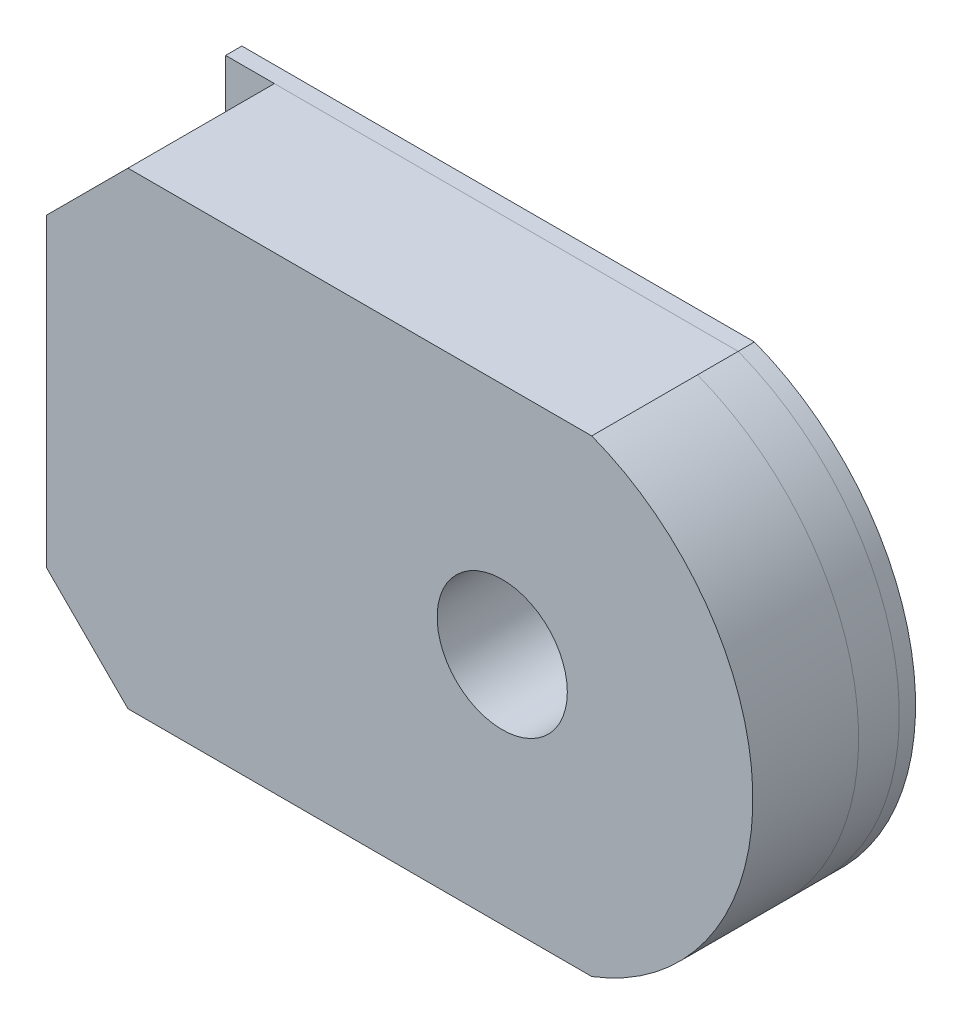
ISO-10303-21;
HEADER;
FILE_DESCRIPTION(('STEP AP214'),'2;1');
FILE_NAME('part.step','',(''),(''),'','','');
FILE_SCHEMA(('AUTOMOTIVE_DESIGN { 1 0 10303 214 1 1 1 1 }'));
ENDSEC;
DATA;
#1=APPLICATION_CONTEXT('core data for automotive mechanical design processes');
#2=APPLICATION_PROTOCOL_DEFINITION('international standard','automotive_design',2000,#1);
#3=PRODUCT_CONTEXT('',#1,'mechanical');
#4=PRODUCT('Part','Part','',(#3));
#5=PRODUCT_RELATED_PRODUCT_CATEGORY('part','',(#4));
#6=PRODUCT_DEFINITION_FORMATION('','',#4);
#7=PRODUCT_DEFINITION_CONTEXT('part definition',#1,'design');
#8=PRODUCT_DEFINITION('design','',#6,#7);
#9=PRODUCT_DEFINITION_SHAPE('','',#8);
#10=(LENGTH_UNIT() NAMED_UNIT(*) SI_UNIT(.MILLI.,.METRE.));
#11=(NAMED_UNIT(*) PLANE_ANGLE_UNIT() SI_UNIT($,.RADIAN.));
#12=(NAMED_UNIT(*) SI_UNIT($,.STERADIAN.) SOLID_ANGLE_UNIT());
#13=UNCERTAINTY_MEASURE_WITH_UNIT(LENGTH_MEASURE(1.E-05),#10,'distance_accuracy_value','');
#14=(GEOMETRIC_REPRESENTATION_CONTEXT(3) GLOBAL_UNCERTAINTY_ASSIGNED_CONTEXT((#13)) GLOBAL_UNIT_ASSIGNED_CONTEXT((#10,
#11,#12)) REPRESENTATION_CONTEXT('',''));
#15=CARTESIAN_POINT('',(0.,0.,0.));
#16=DIRECTION('',(0.,0.,1.));
#17=DIRECTION('',(1.,0.,0.));
#18=AXIS2_PLACEMENT_3D('',#15,#16,#17);
#19=CARTESIAN_POINT('',(-13.6624154236506,-10.5980462863294,-1.));
#20=DIRECTION('',(0.,0.,1.));
#21=DIRECTION('',(1.,0.,0.));
#22=AXIS2_PLACEMENT_3D('',#19,#20,#21);
#23=PLANE('',#22);
#24=CARTESIAN_POINT('',(-13.6624154236506,-10.5980462863294,-1.));
#25=DIRECTION('',(0.,0.,-1.));
#26=DIRECTION('',(1.,0.,0.));
#27=AXIS2_PLACEMENT_3D('',#24,#25,#26);
#28=CIRCLE('',#27,15.4005917094117);
#29=CARTESIAN_POINT('',(-8.16241542365062,3.78695371367061,-1.));
#30=VERTEX_POINT('',#29);
#31=CARTESIAN_POINT('',(-8.16241542365062,-24.9830462863294,-1.));
#32=VERTEX_POINT('',#31);
#33=EDGE_CURVE('E99',#30,#32,#28,.T.);
#34=ORIENTED_EDGE('',*,*,#33,.T.);
#35=DIRECTION('',(-1.,0.,0.));
#36=VECTOR('',#35,1.);
#37=CARTESIAN_POINT('',(-8.16241542365062,-24.9830462863294,-1.));
#38=LINE('',#37,#36);
#39=CARTESIAN_POINT('',(-39.6624154236506,-24.9830462863294,-1.));
#40=VERTEX_POINT('',#39);
#41=EDGE_CURVE('E94',#32,#40,#38,.T.);
#42=ORIENTED_EDGE('',*,*,#41,.T.);
#43=DIRECTION('',(0.,1.,0.));
#44=VECTOR('',#43,1.);
#45=CARTESIAN_POINT('',(-39.6624154236506,-24.9830462863294,-1.));
#46=LINE('',#45,#44);
#47=CARTESIAN_POINT('',(-39.6624154236506,3.78695371367062,-1.));
#48=VERTEX_POINT('',#47);
#49=EDGE_CURVE('E97',#40,#48,#46,.T.);
#50=ORIENTED_EDGE('',*,*,#49,.T.);
#51=DIRECTION('',(1.,0.,0.));
#52=VECTOR('',#51,1.);
#53=CARTESIAN_POINT('',(-39.6624154236506,3.78695371367062,-1.));
#54=LINE('',#53,#52);
#55=EDGE_CURVE('E64',#48,#30,#54,.T.);
#56=ORIENTED_EDGE('',*,*,#55,.T.);
#57=EDGE_LOOP('',(#34,#42,#50,#56));
#58=FACE_BOUND('',#57,.T.);
#59=CARTESIAN_POINT('',(-13.6624154236506,-20.1230462863294,-1.));
#60=DIRECTION('',(0.,0.,-1.));
#61=DIRECTION('',(-1.,0.,0.));
#62=AXIS2_PLACEMENT_3D('',#59,#60,#61);
#63=CIRCLE('',#62,1.475);
#64=CARTESIAN_POINT('',(-15.1374154236506,-20.1230462863294,-1.));
#65=VERTEX_POINT('',#64);
#66=EDGE_CURVE('E114',#65,#65,#63,.T.);
#67=ORIENTED_EDGE('',*,*,#66,.F.);
#68=EDGE_LOOP('',(#67));
#69=FACE_BOUND('',#68,.T.);
#70=CARTESIAN_POINT('',(-13.6624154236506,-1.07304628632939,-1.));
#71=DIRECTION('',(0.,0.,-1.));
#72=DIRECTION('',(-1.,0.,0.));
#73=AXIS2_PLACEMENT_3D('',#70,#71,#72);
#74=CIRCLE('',#73,1.475);
#75=CARTESIAN_POINT('',(-15.1374154236506,-1.07304628632939,-1.));
#76=VERTEX_POINT('',#75);
#77=EDGE_CURVE('E129',#76,#76,#74,.T.);
#78=ORIENTED_EDGE('',*,*,#77,.F.);
#79=EDGE_LOOP('',(#78));
#80=FACE_BOUND('',#79,.T.);
#81=CARTESIAN_POINT('',(-13.6624154236506,-10.5980462863294,-1.));
#82=DIRECTION('',(0.,0.,-1.));
#83=DIRECTION('',(-1.,0.,0.));
#84=AXIS2_PLACEMENT_3D('',#81,#82,#83);
#85=CIRCLE('',#84,3.5);
#86=CARTESIAN_POINT('',(-17.1624154236506,-10.5980462863294,-1.));
#87=VERTEX_POINT('',#86);
#88=EDGE_CURVE('E135',#87,#87,#85,.T.);
#89=ORIENTED_EDGE('',*,*,#88,.F.);
#90=EDGE_LOOP('',(#89));
#91=FACE_BOUND('',#90,.T.);
#92=CARTESIAN_POINT('',(-29.4124154236506,-21.0780462863294,-1.));
#93=DIRECTION('',(0.,0.,-1.));
#94=DIRECTION('',(-1.,0.,0.));
#95=AXIS2_PLACEMENT_3D('',#92,#93,#94);
#96=CIRCLE('',#95,1.98);
#97=CARTESIAN_POINT('',(-31.3924154236506,-21.0780462863294,-1.));
#98=VERTEX_POINT('',#97);
#99=EDGE_CURVE('E141',#98,#98,#96,.T.);
#100=ORIENTED_EDGE('',*,*,#99,.F.);
#101=EDGE_LOOP('',(#100));
#102=FACE_BOUND('',#101,.T.);
#103=CARTESIAN_POINT('',(-29.4124154236506,-0.118046286329387,-1.));
#104=DIRECTION('',(0.,0.,-1.));
#105=DIRECTION('',(-1.,0.,0.));
#106=AXIS2_PLACEMENT_3D('',#103,#104,#105);
#107=CIRCLE('',#106,1.98);
#108=CARTESIAN_POINT('',(-31.3924154236506,-0.118046286329387,-1.));
#109=VERTEX_POINT('',#108);
#110=EDGE_CURVE('E147',#109,#109,#107,.T.);
#111=ORIENTED_EDGE('',*,*,#110,.F.);
#112=EDGE_LOOP('',(#111));
#113=FACE_BOUND('',#112,.T.);
#114=CARTESIAN_POINT('',(-4.6821593025815,-19.5783024073986,-1.));
#115=DIRECTION('',(0.,0.,-1.));
#116=DIRECTION('',(-1.,0.,0.));
#117=AXIS2_PLACEMENT_3D('',#114,#115,#116);
#118=CIRCLE('',#117,1.98000000000002);
#119=CARTESIAN_POINT('',(-6.66215930258152,-19.5783024073986,-1.));
#120=VERTEX_POINT('',#119);
#121=EDGE_CURVE('E153',#120,#120,#118,.T.);
#122=ORIENTED_EDGE('',*,*,#121,.F.);
#123=EDGE_LOOP('',(#122));
#124=FACE_BOUND('',#123,.T.);
#125=CARTESIAN_POINT('',(-4.6821593025815,-1.61779016526022,-1.));
#126=DIRECTION('',(0.,0.,-1.));
#127=DIRECTION('',(-1.,0.,0.));
#128=AXIS2_PLACEMENT_3D('',#125,#126,#127);
#129=CIRCLE('',#128,1.98000000000002);
#130=CARTESIAN_POINT('',(-6.66215930258152,-1.61779016526022,-1.));
#131=VERTEX_POINT('',#130);
#132=EDGE_CURVE('E159',#131,#131,#129,.T.);
#133=ORIENTED_EDGE('',*,*,#132,.F.);
#134=EDGE_LOOP('',(#133));
#135=FACE_BOUND('',#134,.T.);
#136=ADVANCED_FACE('F47',(#58,#69,#80,#91,#102,#113,#124,#135),#23,.F.);
#137=CARTESIAN_POINT('',(-13.6624154236506,-10.5980462863294,0.));
#138=DIRECTION('',(0.,0.,1.));
#139=DIRECTION('',(1.,0.,0.));
#140=AXIS2_PLACEMENT_3D('',#137,#138,#139);
#141=PLANE('',#140);
#142=CARTESIAN_POINT('',(-4.6821593025815,-19.5783024073986,0.));
#143=DIRECTION('',(0.,0.,-1.));
#144=DIRECTION('',(-1.,0.,0.));
#145=AXIS2_PLACEMENT_3D('',#142,#143,#144);
#146=CIRCLE('',#145,1.98000000000002);
#147=CARTESIAN_POINT('',(-6.66215930258152,-19.5783024073986,0.));
#148=VERTEX_POINT('',#147);
#149=EDGE_CURVE('E156',#148,#148,#146,.T.);
#150=ORIENTED_EDGE('',*,*,#149,.T.);
#151=EDGE_LOOP('',(#150));
#152=FACE_BOUND('',#151,.T.);
#153=CARTESIAN_POINT('',(-29.4124154236506,-21.0780462863294,0.));
#154=DIRECTION('',(0.,0.,-1.));
#155=DIRECTION('',(-1.,0.,0.));
#156=AXIS2_PLACEMENT_3D('',#153,#154,#155);
#157=CIRCLE('',#156,1.98);
#158=CARTESIAN_POINT('',(-31.3924154236506,-21.0780462863294,0.));
#159=VERTEX_POINT('',#158);
#160=EDGE_CURVE('E144',#159,#159,#157,.T.);
#161=ORIENTED_EDGE('',*,*,#160,.T.);
#162=EDGE_LOOP('',(#161));
#163=FACE_BOUND('',#162,.T.);
#164=CARTESIAN_POINT('',(-13.6624154236506,-1.07304628632939,0.));
#165=DIRECTION('',(0.,0.,-1.));
#166=DIRECTION('',(-1.,0.,0.));
#167=AXIS2_PLACEMENT_3D('',#164,#165,#166);
#168=CIRCLE('',#167,1.475);
#169=CARTESIAN_POINT('',(-15.1374154236506,-1.07304628632939,0.));
#170=VERTEX_POINT('',#169);
#171=EDGE_CURVE('E132',#170,#170,#168,.T.);
#172=ORIENTED_EDGE('',*,*,#171,.T.);
#173=EDGE_LOOP('',(#172));
#174=FACE_BOUND('',#173,.T.);
#175=CARTESIAN_POINT('',(-13.6624154236506,-10.5980462863294,0.));
#176=DIRECTION('',(0.,0.,-1.));
#177=DIRECTION('',(1.,0.,0.));
#178=AXIS2_PLACEMENT_3D('',#175,#176,#177);
#179=CIRCLE('',#178,15.4005917094117);
#180=CARTESIAN_POINT('',(-8.16241542365062,3.78695371367061,0.));
#181=VERTEX_POINT('',#180);
#182=CARTESIAN_POINT('',(-8.16241542365062,-24.9830462863294,0.));
#183=VERTEX_POINT('',#182);
#184=EDGE_CURVE('E111',#181,#183,#179,.T.);
#185=ORIENTED_EDGE('',*,*,#184,.F.);
#186=DIRECTION('',(1.,0.,0.));
#187=VECTOR('',#186,1.);
#188=CARTESIAN_POINT('',(-39.6624154236506,3.78695371367062,0.));
#189=LINE('',#188,#187);
#190=CARTESIAN_POINT('',(-39.6624154236506,3.78695371367062,0.));
#191=VERTEX_POINT('',#190);
#192=EDGE_CURVE('E87',#191,#181,#189,.T.);
#193=ORIENTED_EDGE('',*,*,#192,.F.);
#194=DIRECTION('',(0.,1.,0.));
#195=VECTOR('',#194,1.);
#196=CARTESIAN_POINT('',(-39.6624154236506,-24.9830462863294,0.));
#197=LINE('',#196,#195);
#198=CARTESIAN_POINT('',(-39.6624154236506,-24.9830462863294,0.));
#199=VERTEX_POINT('',#198);
#200=EDGE_CURVE('E81',#199,#191,#197,.T.);
#201=ORIENTED_EDGE('',*,*,#200,.F.);
#202=DIRECTION('',(-1.,0.,0.));
#203=VECTOR('',#202,1.);
#204=CARTESIAN_POINT('',(-8.16241542365062,-24.9830462863294,0.));
#205=LINE('',#204,#203);
#206=EDGE_CURVE('E103',#183,#199,#205,.T.);
#207=ORIENTED_EDGE('',*,*,#206,.F.);
#208=EDGE_LOOP('',(#185,#193,#201,#207));
#209=FACE_BOUND('',#208,.T.);
#210=CARTESIAN_POINT('',(-13.6624154236506,-20.1230462863294,0.));
#211=DIRECTION('',(0.,0.,-1.));
#212=DIRECTION('',(-1.,0.,0.));
#213=AXIS2_PLACEMENT_3D('',#210,#211,#212);
#214=CIRCLE('',#213,1.475);
#215=CARTESIAN_POINT('',(-15.1374154236506,-20.1230462863294,0.));
#216=VERTEX_POINT('',#215);
#217=EDGE_CURVE('E126',#216,#216,#214,.T.);
#218=ORIENTED_EDGE('',*,*,#217,.T.);
#219=EDGE_LOOP('',(#218));
#220=FACE_BOUND('',#219,.T.);
#221=CARTESIAN_POINT('',(-13.6624154236506,-10.5980462863294,0.));
#222=DIRECTION('',(0.,0.,-1.));
#223=DIRECTION('',(-1.,0.,0.));
#224=AXIS2_PLACEMENT_3D('',#221,#222,#223);
#225=CIRCLE('',#224,3.5);
#226=CARTESIAN_POINT('',(-17.1624154236506,-10.5980462863294,0.));
#227=VERTEX_POINT('',#226);
#228=EDGE_CURVE('E138',#227,#227,#225,.T.);
#229=ORIENTED_EDGE('',*,*,#228,.T.);
#230=EDGE_LOOP('',(#229));
#231=FACE_BOUND('',#230,.T.);
#232=CARTESIAN_POINT('',(-29.4124154236506,-0.118046286329387,0.));
#233=DIRECTION('',(0.,0.,-1.));
#234=DIRECTION('',(-1.,0.,0.));
#235=AXIS2_PLACEMENT_3D('',#232,#233,#234);
#236=CIRCLE('',#235,1.98);
#237=CARTESIAN_POINT('',(-31.3924154236506,-0.118046286329387,0.));
#238=VERTEX_POINT('',#237);
#239=EDGE_CURVE('E150',#238,#238,#236,.T.);
#240=ORIENTED_EDGE('',*,*,#239,.T.);
#241=EDGE_LOOP('',(#240));
#242=FACE_BOUND('',#241,.T.);
#243=CARTESIAN_POINT('',(-4.6821593025815,-1.61779016526022,0.));
#244=DIRECTION('',(0.,0.,-1.));
#245=DIRECTION('',(-1.,0.,0.));
#246=AXIS2_PLACEMENT_3D('',#243,#244,#245);
#247=CIRCLE('',#246,1.98000000000002);
#248=CARTESIAN_POINT('',(-6.66215930258152,-1.61779016526022,0.));
#249=VERTEX_POINT('',#248);
#250=EDGE_CURVE('E162',#249,#249,#247,.T.);
#251=ORIENTED_EDGE('',*,*,#250,.T.);
#252=EDGE_LOOP('',(#251));
#253=FACE_BOUND('',#252,.T.);
#254=ADVANCED_FACE('F122',(#152,#163,#174,#209,#220,#231,#242,#253),#141,.T.);
#255=CARTESIAN_POINT('',(-13.6624154236506,-10.5980462863294,-1.));
#256=DIRECTION('',(0.,0.,1.));
#257=DIRECTION('',(1.,0.,0.));
#258=AXIS2_PLACEMENT_3D('',#255,#256,#257);
#259=CYLINDRICAL_SURFACE('',#258,15.4005917094117);
#260=ORIENTED_EDGE('',*,*,#184,.T.);
#261=DIRECTION('',(0.,0.,1.));
#262=VECTOR('',#261,1.);
#263=CARTESIAN_POINT('',(-8.16241542365062,-24.9830462863294,-1.));
#264=LINE('',#263,#262);
#265=EDGE_CURVE('E12',#32,#183,#264,.T.);
#266=ORIENTED_EDGE('',*,*,#265,.F.);
#267=ORIENTED_EDGE('',*,*,#33,.F.);
#268=DIRECTION('',(0.,0.,1.));
#269=VECTOR('',#268,1.);
#270=CARTESIAN_POINT('',(-8.16241542365062,3.78695371367061,-1.));
#271=LINE('',#270,#269);
#272=EDGE_CURVE('E107',#30,#181,#271,.T.);
#273=ORIENTED_EDGE('',*,*,#272,.T.);
#274=EDGE_LOOP('',(#260,#266,#267,#273));
#275=FACE_BOUND('',#274,.T.);
#276=ADVANCED_FACE('F49',(#275),#259,.T.);
#277=CARTESIAN_POINT('',(-8.16241542365062,-24.9830462863294,-1.));
#278=DIRECTION('',(0.,1.,0.));
#279=DIRECTION('',(0.,0.,1.));
#280=AXIS2_PLACEMENT_3D('',#277,#278,#279);
#281=PLANE('',#280);
#282=ORIENTED_EDGE('',*,*,#206,.T.);
#283=DIRECTION('',(0.,0.,1.));
#284=VECTOR('',#283,1.);
#285=CARTESIAN_POINT('',(-39.6624154236506,-24.9830462863294,-1.));
#286=LINE('',#285,#284);
#287=EDGE_CURVE('E56',#40,#199,#286,.T.);
#288=ORIENTED_EDGE('',*,*,#287,.F.);
#289=ORIENTED_EDGE('',*,*,#41,.F.);
#290=ORIENTED_EDGE('',*,*,#265,.T.);
#291=EDGE_LOOP('',(#282,#288,#289,#290));
#292=FACE_BOUND('',#291,.T.);
#293=ADVANCED_FACE('F102',(#292),#281,.F.);
#294=CARTESIAN_POINT('',(-39.6624154236506,-24.9830462863294,-1.));
#295=DIRECTION('',(1.,0.,0.));
#296=DIRECTION('',(0.,0.,-1.));
#297=AXIS2_PLACEMENT_3D('',#294,#295,#296);
#298=PLANE('',#297);
#299=ORIENTED_EDGE('',*,*,#200,.T.);
#300=DIRECTION('',(0.,0.,1.));
#301=VECTOR('',#300,1.);
#302=CARTESIAN_POINT('',(-39.6624154236506,3.78695371367062,-1.));
#303=LINE('',#302,#301);
#304=EDGE_CURVE('E104',#48,#191,#303,.T.);
#305=ORIENTED_EDGE('',*,*,#304,.F.);
#306=ORIENTED_EDGE('',*,*,#49,.F.);
#307=ORIENTED_EDGE('',*,*,#287,.T.);
#308=EDGE_LOOP('',(#299,#305,#306,#307));
#309=FACE_BOUND('',#308,.T.);
#310=ADVANCED_FACE('F105',(#309),#298,.F.);
#311=CARTESIAN_POINT('',(-39.6624154236506,3.78695371367062,-1.));
#312=DIRECTION('',(0.,-1.,0.));
#313=DIRECTION('',(1.,0.,0.));
#314=AXIS2_PLACEMENT_3D('',#311,#312,#313);
#315=PLANE('',#314);
#316=ORIENTED_EDGE('',*,*,#192,.T.);
#317=ORIENTED_EDGE('',*,*,#272,.F.);
#318=ORIENTED_EDGE('',*,*,#55,.F.);
#319=ORIENTED_EDGE('',*,*,#304,.T.);
#320=EDGE_LOOP('',(#316,#317,#318,#319));
#321=FACE_BOUND('',#320,.T.);
#322=ADVANCED_FACE('F119',(#321),#315,.F.);
#323=CARTESIAN_POINT('',(-13.6624154236506,-20.1230462863294,-1.));
#324=DIRECTION('',(0.,0.,1.));
#325=DIRECTION('',(1.,0.,0.));
#326=AXIS2_PLACEMENT_3D('',#323,#324,#325);
#327=CYLINDRICAL_SURFACE('',#326,1.475);
#328=ORIENTED_EDGE('',*,*,#66,.T.);
#329=EDGE_LOOP('',(#328));
#330=FACE_BOUND('',#329,.T.);
#331=ORIENTED_EDGE('',*,*,#217,.F.);
#332=EDGE_LOOP('',(#331));
#333=FACE_BOUND('',#332,.T.);
#334=ADVANCED_FACE('F179',(#330,#333),#327,.F.);
#335=CARTESIAN_POINT('',(-13.6624154236506,-1.07304628632939,-1.));
#336=DIRECTION('',(0.,0.,1.));
#337=DIRECTION('',(1.,0.,0.));
#338=AXIS2_PLACEMENT_3D('',#335,#336,#337);
#339=CYLINDRICAL_SURFACE('',#338,1.475);
#340=ORIENTED_EDGE('',*,*,#77,.T.);
#341=EDGE_LOOP('',(#340));
#342=FACE_BOUND('',#341,.T.);
#343=ORIENTED_EDGE('',*,*,#171,.F.);
#344=EDGE_LOOP('',(#343));
#345=FACE_BOUND('',#344,.T.);
#346=ADVANCED_FACE('F225',(#342,#345),#339,.F.);
#347=CARTESIAN_POINT('',(-13.6624154236506,-10.5980462863294,-1.));
#348=DIRECTION('',(0.,0.,1.));
#349=DIRECTION('',(1.,0.,0.));
#350=AXIS2_PLACEMENT_3D('',#347,#348,#349);
#351=CYLINDRICAL_SURFACE('',#350,3.5);
#352=ORIENTED_EDGE('',*,*,#88,.T.);
#353=EDGE_LOOP('',(#352));
#354=FACE_BOUND('',#353,.T.);
#355=ORIENTED_EDGE('',*,*,#228,.F.);
#356=EDGE_LOOP('',(#355));
#357=FACE_BOUND('',#356,.T.);
#358=ADVANCED_FACE('F233',(#354,#357),#351,.F.);
#359=CARTESIAN_POINT('',(-29.4124154236506,-21.0780462863294,-1.));
#360=DIRECTION('',(0.,0.,1.));
#361=DIRECTION('',(1.,0.,0.));
#362=AXIS2_PLACEMENT_3D('',#359,#360,#361);
#363=CYLINDRICAL_SURFACE('',#362,1.98);
#364=ORIENTED_EDGE('',*,*,#99,.T.);
#365=EDGE_LOOP('',(#364));
#366=FACE_BOUND('',#365,.T.);
#367=ORIENTED_EDGE('',*,*,#160,.F.);
#368=EDGE_LOOP('',(#367));
#369=FACE_BOUND('',#368,.T.);
#370=ADVANCED_FACE('F241',(#366,#369),#363,.F.);
#371=CARTESIAN_POINT('',(-29.4124154236506,-0.118046286329387,-1.));
#372=DIRECTION('',(0.,0.,1.));
#373=DIRECTION('',(1.,0.,0.));
#374=AXIS2_PLACEMENT_3D('',#371,#372,#373);
#375=CYLINDRICAL_SURFACE('',#374,1.98);
#376=ORIENTED_EDGE('',*,*,#110,.T.);
#377=EDGE_LOOP('',(#376));
#378=FACE_BOUND('',#377,.T.);
#379=ORIENTED_EDGE('',*,*,#239,.F.);
#380=EDGE_LOOP('',(#379));
#381=FACE_BOUND('',#380,.T.);
#382=ADVANCED_FACE('F250',(#378,#381),#375,.F.);
#383=CARTESIAN_POINT('',(-4.6821593025815,-19.5783024073986,-1.));
#384=DIRECTION('',(0.,0.,1.));
#385=DIRECTION('',(1.,0.,0.));
#386=AXIS2_PLACEMENT_3D('',#383,#384,#385);
#387=CYLINDRICAL_SURFACE('',#386,1.98000000000002);
#388=ORIENTED_EDGE('',*,*,#121,.T.);
#389=EDGE_LOOP('',(#388));
#390=FACE_BOUND('',#389,.T.);
#391=ORIENTED_EDGE('',*,*,#149,.F.);
#392=EDGE_LOOP('',(#391));
#393=FACE_BOUND('',#392,.T.);
#394=ADVANCED_FACE('F259',(#390,#393),#387,.F.);
#395=CARTESIAN_POINT('',(-4.6821593025815,-1.61779016526022,-1.));
#396=DIRECTION('',(0.,0.,1.));
#397=DIRECTION('',(1.,0.,0.));
#398=AXIS2_PLACEMENT_3D('',#395,#396,#397);
#399=CYLINDRICAL_SURFACE('',#398,1.98000000000002);
#400=ORIENTED_EDGE('',*,*,#132,.T.);
#401=EDGE_LOOP('',(#400));
#402=FACE_BOUND('',#401,.T.);
#403=ORIENTED_EDGE('',*,*,#250,.F.);
#404=EDGE_LOOP('',(#403));
#405=FACE_BOUND('',#404,.T.);
#406=ADVANCED_FACE('F168',(#402,#405),#399,.F.);
#407=CLOSED_SHELL('',(#136,#254,#276,#293,#310,#322,#334,#346,#358,#370,#382,#394,#406));
#408=MANIFOLD_SOLID_BREP('B2',#407);
#409=CARTESIAN_POINT('',(-13.6624154236506,-10.5980462863294,1.74455679792347E-13));
#410=DIRECTION('',(0.,0.,1.));
#411=DIRECTION('',(1.,0.,0.));
#412=AXIS2_PLACEMENT_3D('',#409,#410,#411);
#413=PLANE('',#412);
#414=DIRECTION('',(-0.707106781186547,-0.707106781186548,0.));
#415=VECTOR('',#414,1.);
#416=CARTESIAN_POINT('',(-36.6624154236506,3.78695371367061,1.74455679792347E-13));
#417=LINE('',#416,#415);
#418=CARTESIAN_POINT('',(-36.6624154236506,3.78695371367061,1.74455679792347E-13));
#419=VERTEX_POINT('',#418);
#420=CARTESIAN_POINT('',(-41.6624154236506,-1.21304628632939,1.74455679792347E-13));
#421=VERTEX_POINT('',#420);
#422=EDGE_CURVE('E377',#419,#421,#417,.T.);
#423=ORIENTED_EDGE('',*,*,#422,.F.);
#424=DIRECTION('',(-1.,0.,0.));
#425=VECTOR('',#424,1.);
#426=CARTESIAN_POINT('',(-19.1624154236506,3.78695371367061,1.74455679792347E-13));
#427=LINE('',#426,#425);
#428=CARTESIAN_POINT('',(-8.16241542365062,3.78695371367061,1.74455679792347E-13));
#429=VERTEX_POINT('',#428);
#430=EDGE_CURVE('E361',#429,#419,#427,.T.);
#431=ORIENTED_EDGE('',*,*,#430,.F.);
#432=CARTESIAN_POINT('',(-13.6624154236506,-10.5980462863294,1.74455679792347E-13));
#433=DIRECTION('',(0.,0.,1.));
#434=DIRECTION('',(1.,0.,0.));
#435=AXIS2_PLACEMENT_3D('',#432,#433,#434);
#436=CIRCLE('',#435,15.4005917094117);
#437=CARTESIAN_POINT('',(-8.16241542365062,-24.9830462863294,1.74455679792347E-13));
#438=VERTEX_POINT('',#437);
#439=EDGE_CURVE('E371',#438,#429,#436,.T.);
#440=ORIENTED_EDGE('',*,*,#439,.F.);
#441=DIRECTION('',(1.,0.,0.));
#442=VECTOR('',#441,1.);
#443=CARTESIAN_POINT('',(-19.1624154236506,-24.9830462863294,1.74455679792347E-13));
#444=LINE('',#443,#442);
#445=CARTESIAN_POINT('',(-36.6624154236506,-24.9830462863294,1.74455679792347E-13));
#446=VERTEX_POINT('',#445);
#447=EDGE_CURVE('E395',#446,#438,#444,.T.);
#448=ORIENTED_EDGE('',*,*,#447,.F.);
#449=DIRECTION('',(0.707106781186548,-0.707106781186547,0.));
#450=VECTOR('',#449,1.);
#451=CARTESIAN_POINT('',(-41.6624154236506,-19.9830462863294,1.74455679792347E-13));
#452=LINE('',#451,#450);
#453=CARTESIAN_POINT('',(-41.6624154236506,-19.9830462863294,1.74455679792347E-13));
#454=VERTEX_POINT('',#453);
#455=EDGE_CURVE('E386',#454,#446,#452,.T.);
#456=ORIENTED_EDGE('',*,*,#455,.F.);
#457=DIRECTION('',(0.,-1.,0.));
#458=VECTOR('',#457,1.);
#459=CARTESIAN_POINT('',(-41.6624154236506,-1.21304628632939,1.74455679792347E-13));
#460=LINE('',#459,#458);
#461=EDGE_CURVE('E383',#421,#454,#460,.T.);
#462=ORIENTED_EDGE('',*,*,#461,.F.);
#463=EDGE_LOOP('',(#423,#431,#440,#448,#456,#462));
#464=FACE_BOUND('',#463,.T.);
#465=CARTESIAN_POINT('',(-29.4124154236506,-21.0780462863294,1.74455679792347E-13));
#466=DIRECTION('',(0.,0.,1.));
#467=DIRECTION('',(1.,0.,0.));
#468=AXIS2_PLACEMENT_3D('',#465,#466,#467);
#469=CIRCLE('',#468,1.98);
#470=CARTESIAN_POINT('',(-27.4324154236506,-21.0780462863294,1.74455679792347E-13));
#471=VERTEX_POINT('',#470);
#472=EDGE_CURVE('E384',#471,#471,#469,.T.);
#473=ORIENTED_EDGE('',*,*,#472,.T.);
#474=EDGE_LOOP('',(#473));
#475=FACE_BOUND('',#474,.T.);
#476=CARTESIAN_POINT('',(-29.4124154236506,-0.118046286329387,1.74455679792347E-13));
#477=DIRECTION('',(0.,0.,1.));
#478=DIRECTION('',(1.,0.,0.));
#479=AXIS2_PLACEMENT_3D('',#476,#477,#478);
#480=CIRCLE('',#479,1.98);
#481=CARTESIAN_POINT('',(-27.4324154236506,-0.118046286329387,1.74455679792347E-13));
#482=VERTEX_POINT('',#481);
#483=EDGE_CURVE('E389',#482,#482,#480,.T.);
#484=ORIENTED_EDGE('',*,*,#483,.T.);
#485=EDGE_LOOP('',(#484));
#486=FACE_BOUND('',#485,.T.);
#487=CARTESIAN_POINT('',(-13.6624154236506,-10.5980462863294,1.74455679792347E-13));
#488=DIRECTION('',(0.,0.,1.));
#489=DIRECTION('',(1.,0.,0.));
#490=AXIS2_PLACEMENT_3D('',#487,#488,#489);
#491=CIRCLE('',#490,6.3);
#492=CARTESIAN_POINT('',(-7.36241542365062,-10.5980462863294,1.74455679792347E-13));
#493=VERTEX_POINT('',#492);
#494=EDGE_CURVE('E570',#493,#493,#491,.T.);
#495=ORIENTED_EDGE('',*,*,#494,.T.);
#496=EDGE_LOOP('',(#495));
#497=FACE_BOUND('',#496,.T.);
#498=CARTESIAN_POINT('',(-13.6624154236506,-1.07304628632939,1.74455679792347E-13));
#499=DIRECTION('',(0.,0.,1.));
#500=DIRECTION('',(1.,0.,0.));
#501=AXIS2_PLACEMENT_3D('',#498,#499,#500);
#502=CIRCLE('',#501,1.475);
#503=CARTESIAN_POINT('',(-12.1874154236506,-1.07304628632939,1.74455679792347E-13));
#504=VERTEX_POINT('',#503);
#505=EDGE_CURVE('E567',#504,#504,#502,.T.);
#506=ORIENTED_EDGE('',*,*,#505,.T.);
#507=EDGE_LOOP('',(#506));
#508=FACE_BOUND('',#507,.T.);
#509=CARTESIAN_POINT('',(-13.6624154236506,-20.1230462863294,1.74455679792347E-13));
#510=DIRECTION('',(0.,0.,1.));
#511=DIRECTION('',(1.,0.,0.));
#512=AXIS2_PLACEMENT_3D('',#509,#510,#511);
#513=CIRCLE('',#512,1.475);
#514=CARTESIAN_POINT('',(-12.1874154236506,-20.1230462863294,1.74455679792347E-13));
#515=VERTEX_POINT('',#514);
#516=EDGE_CURVE('E564',#515,#515,#513,.T.);
#517=ORIENTED_EDGE('',*,*,#516,.T.);
#518=EDGE_LOOP('',(#517));
#519=FACE_BOUND('',#518,.T.);
#520=CARTESIAN_POINT('',(-4.6821593025815,-19.5783024073986,1.74455679792347E-13));
#521=DIRECTION('',(0.,0.,1.));
#522=DIRECTION('',(1.,0.,0.));
#523=AXIS2_PLACEMENT_3D('',#520,#521,#522);
#524=CIRCLE('',#523,1.98000000000002);
#525=CARTESIAN_POINT('',(-2.70215930258148,-19.5783024073986,1.74455679792347E-13));
#526=VERTEX_POINT('',#525);
#527=EDGE_CURVE('E561',#526,#526,#524,.T.);
#528=ORIENTED_EDGE('',*,*,#527,.T.);
#529=EDGE_LOOP('',(#528));
#530=FACE_BOUND('',#529,.T.);
#531=CARTESIAN_POINT('',(-4.6821593025815,-1.61779016526022,1.74455679792347E-13));
#532=DIRECTION('',(0.,0.,1.));
#533=DIRECTION('',(1.,0.,0.));
#534=AXIS2_PLACEMENT_3D('',#531,#532,#533);
#535=CIRCLE('',#534,1.98000000000002);
#536=CARTESIAN_POINT('',(-2.70215930258148,-1.61779016526022,1.74455679792347E-13));
#537=VERTEX_POINT('',#536);
#538=EDGE_CURVE('E558',#537,#537,#535,.T.);
#539=ORIENTED_EDGE('',*,*,#538,.T.);
#540=EDGE_LOOP('',(#539));
#541=FACE_BOUND('',#540,.T.);
#542=CARTESIAN_POINT('',(-22.6426715447198,-1.61779016526022,1.74455679792347E-13));
#543=DIRECTION('',(0.,0.,1.));
#544=DIRECTION('',(1.,0.,0.));
#545=AXIS2_PLACEMENT_3D('',#542,#543,#544);
#546=CIRCLE('',#545,1.05);
#547=CARTESIAN_POINT('',(-21.5926715447198,-1.61779016526022,1.74455679792347E-13));
#548=VERTEX_POINT('',#547);
#549=EDGE_CURVE('E555',#548,#548,#546,.T.);
#550=ORIENTED_EDGE('',*,*,#549,.T.);
#551=EDGE_LOOP('',(#550));
#552=FACE_BOUND('',#551,.T.);
#553=CARTESIAN_POINT('',(-22.6426715447198,-19.5783024073986,1.74455679792347E-13));
#554=DIRECTION('',(0.,0.,1.));
#555=DIRECTION('',(1.,0.,0.));
#556=AXIS2_PLACEMENT_3D('',#553,#554,#555);
#557=CIRCLE('',#556,1.05);
#558=CARTESIAN_POINT('',(-21.5926715447198,-19.5783024073986,1.74455679792347E-13));
#559=VERTEX_POINT('',#558);
#560=EDGE_CURVE('E552',#559,#559,#557,.T.);
#561=ORIENTED_EDGE('',*,*,#560,.T.);
#562=EDGE_LOOP('',(#561));
#563=FACE_BOUND('',#562,.T.);
#564=CARTESIAN_POINT('',(-17.6624154236506,-3.66984305605386,1.74455679792347E-13));
#565=DIRECTION('',(0.,0.,1.));
#566=DIRECTION('',(1.,0.,0.));
#567=AXIS2_PLACEMENT_3D('',#564,#565,#566);
#568=CIRCLE('',#567,0.85);
#569=CARTESIAN_POINT('',(-16.8124154236506,-3.66984305605386,1.74455679792347E-13));
#570=VERTEX_POINT('',#569);
#571=EDGE_CURVE('E549',#570,#570,#568,.T.);
#572=ORIENTED_EDGE('',*,*,#571,.T.);
#573=EDGE_LOOP('',(#572));
#574=FACE_BOUND('',#573,.T.);
#575=CARTESIAN_POINT('',(-9.66241542365067,-17.5262495166049,1.74455679792347E-13));
#576=DIRECTION('',(0.,0.,1.));
#577=DIRECTION('',(1.,0.,0.));
#578=AXIS2_PLACEMENT_3D('',#575,#576,#577);
#579=CIRCLE('',#578,0.85);
#580=CARTESIAN_POINT('',(-8.81241542365067,-17.5262495166049,1.74455679792347E-13));
#581=VERTEX_POINT('',#580);
#582=EDGE_CURVE('E546',#581,#581,#579,.T.);
#583=ORIENTED_EDGE('',*,*,#582,.T.);
#584=EDGE_LOOP('',(#583));
#585=FACE_BOUND('',#584,.T.);
#586=ADVANCED_FACE('F318',(#464,#475,#486,#497,#508,#519,#530,#541,#552,#563,#574,#585),#413,.F.);
#587=CARTESIAN_POINT('',(-36.6624154236506,3.78695371367061,2.50000000000017));
#588=DIRECTION('',(0.707106781186548,-0.707106781186547,0.));
#589=DIRECTION('',(0.707106781186547,0.707106781186548,0.));
#590=AXIS2_PLACEMENT_3D('',#587,#588,#589);
#591=PLANE('',#590);
#592=ORIENTED_EDGE('',*,*,#422,.T.);
#593=DIRECTION('',(0.,0.,-1.));
#594=VECTOR('',#593,1.);
#595=CARTESIAN_POINT('',(-41.6624154236506,-1.21304628632939,2.50000000000017));
#596=LINE('',#595,#594);
#597=CARTESIAN_POINT('',(-41.6624154236506,-1.21304628632939,9.00000000000017));
#598=VERTEX_POINT('',#597);
#599=EDGE_CURVE('E45',#598,#421,#596,.T.);
#600=ORIENTED_EDGE('',*,*,#599,.F.);
#601=DIRECTION('',(-0.707106781186547,-0.707106781186548,0.));
#602=VECTOR('',#601,1.);
#603=CARTESIAN_POINT('',(-36.6624154236506,3.78695371367061,9.00000000000017));
#604=LINE('',#603,#602);
#605=CARTESIAN_POINT('',(-36.6624154236506,3.78695371367061,9.00000000000017));
#606=VERTEX_POINT('',#605);
#607=EDGE_CURVE('E379',#606,#598,#604,.T.);
#608=ORIENTED_EDGE('',*,*,#607,.F.);
#609=DIRECTION('',(0.,0.,-1.));
#610=VECTOR('',#609,1.);
#611=CARTESIAN_POINT('',(-36.6624154236506,3.78695371367061,2.50000000000017));
#612=LINE('',#611,#610);
#613=EDGE_CURVE('E367',#606,#419,#612,.T.);
#614=ORIENTED_EDGE('',*,*,#613,.T.);
#615=EDGE_LOOP('',(#592,#600,#608,#614));
#616=FACE_BOUND('',#615,.T.);
#617=ADVANCED_FACE('F320',(#616),#591,.F.);
#618=CARTESIAN_POINT('',(-41.6624154236506,-1.21304628632939,2.50000000000017));
#619=DIRECTION('',(1.,0.,0.));
#620=DIRECTION('',(0.,1.,0.));
#621=AXIS2_PLACEMENT_3D('',#618,#619,#620);
#622=PLANE('',#621);
#623=ORIENTED_EDGE('',*,*,#461,.T.);
#624=DIRECTION('',(0.,0.,-1.));
#625=VECTOR('',#624,1.);
#626=CARTESIAN_POINT('',(-41.6624154236506,-19.9830462863294,2.50000000000017));
#627=LINE('',#626,#625);
#628=CARTESIAN_POINT('',(-41.6624154236506,-19.9830462863294,9.00000000000017));
#629=VERTEX_POINT('',#628);
#630=EDGE_CURVE('E328',#629,#454,#627,.T.);
#631=ORIENTED_EDGE('',*,*,#630,.F.);
#632=DIRECTION('',(0.,-1.,0.));
#633=VECTOR('',#632,1.);
#634=CARTESIAN_POINT('',(-41.6624154236506,-19.9830462863294,9.00000000000017));
#635=LINE('',#634,#633);
#636=EDGE_CURVE('E673',#598,#629,#635,.T.);
#637=ORIENTED_EDGE('',*,*,#636,.F.);
#638=ORIENTED_EDGE('',*,*,#599,.T.);
#639=EDGE_LOOP('',(#623,#631,#637,#638));
#640=FACE_BOUND('',#639,.T.);
#641=ADVANCED_FACE('F429',(#640),#622,.F.);
#642=CARTESIAN_POINT('',(-41.6624154236506,-19.9830462863294,2.50000000000017));
#643=DIRECTION('',(0.707106781186547,0.707106781186548,0.));
#644=DIRECTION('',(-0.707106781186548,0.707106781186547,0.));
#645=AXIS2_PLACEMENT_3D('',#642,#643,#644);
#646=PLANE('',#645);
#647=ORIENTED_EDGE('',*,*,#455,.T.);
#648=DIRECTION('',(0.,0.,-1.));
#649=VECTOR('',#648,1.);
#650=CARTESIAN_POINT('',(-36.6624154236506,-24.9830462863294,2.50000000000017));
#651=LINE('',#650,#649);
#652=CARTESIAN_POINT('',(-36.6624154236506,-24.9830462863294,9.00000000000017));
#653=VERTEX_POINT('',#652);
#654=EDGE_CURVE('E398',#653,#446,#651,.T.);
#655=ORIENTED_EDGE('',*,*,#654,.F.);
#656=DIRECTION('',(0.707106781186548,-0.707106781186547,0.));
#657=VECTOR('',#656,1.);
#658=CARTESIAN_POINT('',(-36.6624154236506,-24.9830462863294,9.00000000000017));
#659=LINE('',#658,#657);
#660=EDGE_CURVE('E680',#629,#653,#659,.T.);
#661=ORIENTED_EDGE('',*,*,#660,.F.);
#662=ORIENTED_EDGE('',*,*,#630,.T.);
#663=EDGE_LOOP('',(#647,#655,#661,#662));
#664=FACE_BOUND('',#663,.T.);
#665=ADVANCED_FACE('F426',(#664),#646,.F.);
#666=CARTESIAN_POINT('',(-19.1624154236506,-24.9830462863294,2.50000000000017));
#667=DIRECTION('',(0.,1.,0.));
#668=DIRECTION('',(0.,0.,1.));
#669=AXIS2_PLACEMENT_3D('',#666,#667,#668);
#670=PLANE('',#669);
#671=ORIENTED_EDGE('',*,*,#447,.T.);
#672=DIRECTION('',(0.,0.,-1.));
#673=VECTOR('',#672,1.);
#674=CARTESIAN_POINT('',(-8.16241542365062,-24.9830462863294,2.50000000000017));
#675=LINE('',#674,#673);
#676=CARTESIAN_POINT('',(-8.16241542365062,-24.9830462863294,2.50000000000017));
#677=VERTEX_POINT('',#676);
#678=EDGE_CURVE('E401',#677,#438,#675,.T.);
#679=ORIENTED_EDGE('',*,*,#678,.F.);
#680=DIRECTION('',(0.,0.,-1.));
#681=VECTOR('',#680,1.);
#682=CARTESIAN_POINT('',(-8.16241542365061,-24.9830462863294,9.00000000000017));
#683=LINE('',#682,#681);
#684=CARTESIAN_POINT('',(-8.16241542365061,-24.9830462863294,9.00000000000017));
#685=VERTEX_POINT('',#684);
#686=EDGE_CURVE('E499',#685,#677,#683,.T.);
#687=ORIENTED_EDGE('',*,*,#686,.F.);
#688=DIRECTION('',(1.,0.,0.));
#689=VECTOR('',#688,1.);
#690=CARTESIAN_POINT('',(-8.16241542365062,-24.9830462863294,9.00000000000017));
#691=LINE('',#690,#689);
#692=EDGE_CURVE('E683',#653,#685,#691,.T.);
#693=ORIENTED_EDGE('',*,*,#692,.F.);
#694=ORIENTED_EDGE('',*,*,#654,.T.);
#695=EDGE_LOOP('',(#671,#679,#687,#693,#694));
#696=FACE_BOUND('',#695,.T.);
#697=ADVANCED_FACE('F422',(#696),#670,.F.);
#698=CARTESIAN_POINT('',(-13.6624154236506,-10.5980462863294,2.50000000000017));
#699=DIRECTION('',(0.,0.,-1.));
#700=DIRECTION('',(-1.,0.,0.));
#701=AXIS2_PLACEMENT_3D('',#698,#699,#700);
#702=CYLINDRICAL_SURFACE('',#701,15.4005917094117);
#703=ORIENTED_EDGE('',*,*,#439,.T.);
#704=DIRECTION('',(0.,0.,-1.));
#705=VECTOR('',#704,1.);
#706=CARTESIAN_POINT('',(-8.16241542365062,3.78695371367061,2.50000000000017));
#707=LINE('',#706,#705);
#708=CARTESIAN_POINT('',(-8.16241542365062,3.78695371367061,2.50000000000017));
#709=VERTEX_POINT('',#708);
#710=EDGE_CURVE('E337',#709,#429,#707,.T.);
#711=ORIENTED_EDGE('',*,*,#710,.F.);
#712=CARTESIAN_POINT('',(-13.6625687683024,-10.5980462863294,2.50000000000018));
#713=DIRECTION('',(0.,0.,1.));
#714=DIRECTION('',(0.357137822361272,-0.934051698697159,0.));
#715=AXIS2_PLACEMENT_3D('',#712,#713,#714);
#716=CIRCLE('',#715,15.4006464739206);
#717=EDGE_CURVE('E370',#677,#709,#716,.T.);
#718=ORIENTED_EDGE('',*,*,#717,.F.);
#719=ORIENTED_EDGE('',*,*,#678,.T.);
#720=EDGE_LOOP('',(#703,#711,#718,#719));
#721=FACE_BOUND('',#720,.T.);
#722=ADVANCED_FACE('F412',(#721),#702,.T.);
#723=CARTESIAN_POINT('',(-19.1624154236506,3.78695371367061,2.50000000000017));
#724=DIRECTION('',(0.,-1.,0.));
#725=DIRECTION('',(0.,0.,-1.));
#726=AXIS2_PLACEMENT_3D('',#723,#724,#725);
#727=PLANE('',#726);
#728=ORIENTED_EDGE('',*,*,#430,.T.);
#729=ORIENTED_EDGE('',*,*,#613,.F.);
#730=DIRECTION('',(-1.,0.,0.));
#731=VECTOR('',#730,1.);
#732=CARTESIAN_POINT('',(-36.6624154236506,3.78695371367061,9.00000000000017));
#733=LINE('',#732,#731);
#734=CARTESIAN_POINT('',(-8.16241542365062,3.78695371367061,9.00000000000017));
#735=VERTEX_POINT('',#734);
#736=EDGE_CURVE('E511',#735,#606,#733,.T.);
#737=ORIENTED_EDGE('',*,*,#736,.F.);
#738=DIRECTION('',(0.,0.,-1.));
#739=VECTOR('',#738,1.);
#740=CARTESIAN_POINT('',(-8.16241542365062,3.78695371367061,9.00000000000017));
#741=LINE('',#740,#739);
#742=EDGE_CURVE('E507',#735,#709,#741,.T.);
#743=ORIENTED_EDGE('',*,*,#742,.T.);
#744=ORIENTED_EDGE('',*,*,#710,.T.);
#745=EDGE_LOOP('',(#728,#729,#737,#743,#744));
#746=FACE_BOUND('',#745,.T.);
#747=ADVANCED_FACE('F365',(#746),#727,.F.);
#748=CARTESIAN_POINT('',(-29.4124154236506,-21.0780462863294,2.50000000000017));
#749=DIRECTION('',(0.,0.,-1.));
#750=DIRECTION('',(-1.,0.,0.));
#751=AXIS2_PLACEMENT_3D('',#748,#749,#750);
#752=CYLINDRICAL_SURFACE('',#751,1.98);
#753=CARTESIAN_POINT('',(-29.4124154236506,-21.0780462863294,2.50000000000017));
#754=DIRECTION('',(0.,0.,-1.));
#755=DIRECTION('',(-1.,0.,0.));
#756=AXIS2_PLACEMENT_3D('',#753,#754,#755);
#757=CIRCLE('',#756,1.98);
#758=CARTESIAN_POINT('',(-31.3924154236506,-21.0780462863294,2.50000000000017));
#759=VERTEX_POINT('',#758);
#760=EDGE_CURVE('E543',#759,#759,#757,.T.);
#761=ORIENTED_EDGE('',*,*,#760,.F.);
#762=EDGE_LOOP('',(#761));
#763=FACE_BOUND('',#762,.T.);
#764=ORIENTED_EDGE('',*,*,#472,.F.);
#765=EDGE_LOOP('',(#764));
#766=FACE_BOUND('',#765,.T.);
#767=ADVANCED_FACE('F440',(#763,#766),#752,.F.);
#768=CARTESIAN_POINT('',(-29.4124154236506,-0.118046286329387,2.50000000000017));
#769=DIRECTION('',(0.,0.,-1.));
#770=DIRECTION('',(-1.,0.,0.));
#771=AXIS2_PLACEMENT_3D('',#768,#769,#770);
#772=CYLINDRICAL_SURFACE('',#771,1.98);
#773=CARTESIAN_POINT('',(-29.4124154236506,-0.118046286329387,2.50000000000017));
#774=DIRECTION('',(0.,0.,-1.));
#775=DIRECTION('',(-1.,0.,0.));
#776=AXIS2_PLACEMENT_3D('',#773,#774,#775);
#777=CIRCLE('',#776,1.98);
#778=CARTESIAN_POINT('',(-31.3924154236506,-0.118046286329387,2.50000000000017));
#779=VERTEX_POINT('',#778);
#780=EDGE_CURVE('E540',#779,#779,#777,.T.);
#781=ORIENTED_EDGE('',*,*,#780,.F.);
#782=EDGE_LOOP('',(#781));
#783=FACE_BOUND('',#782,.T.);
#784=ORIENTED_EDGE('',*,*,#483,.F.);
#785=EDGE_LOOP('',(#784));
#786=FACE_BOUND('',#785,.T.);
#787=ADVANCED_FACE('F443',(#783,#786),#772,.F.);
#788=CARTESIAN_POINT('',(-13.6624154236506,-10.5980462863294,2.50000000000017));
#789=DIRECTION('',(0.,0.,-1.));
#790=DIRECTION('',(-1.,0.,0.));
#791=AXIS2_PLACEMENT_3D('',#788,#789,#790);
#792=CYLINDRICAL_SURFACE('',#791,6.3);
#793=CARTESIAN_POINT('',(-13.6624154236506,-10.5980462863294,2.50000000000017));
#794=DIRECTION('',(0.,0.,-1.));
#795=DIRECTION('',(-1.,0.,0.));
#796=AXIS2_PLACEMENT_3D('',#793,#794,#795);
#797=CIRCLE('',#796,6.3);
#798=CARTESIAN_POINT('',(-19.9624154236506,-10.5980462863294,2.50000000000017));
#799=VERTEX_POINT('',#798);
#800=EDGE_CURVE('E537',#799,#799,#797,.T.);
#801=ORIENTED_EDGE('',*,*,#800,.F.);
#802=EDGE_LOOP('',(#801));
#803=FACE_BOUND('',#802,.T.);
#804=ORIENTED_EDGE('',*,*,#494,.F.);
#805=EDGE_LOOP('',(#804));
#806=FACE_BOUND('',#805,.T.);
#807=ADVANCED_FACE('F447',(#803,#806),#792,.F.);
#808=CARTESIAN_POINT('',(-13.6624154236506,-1.07304628632939,2.50000000000017));
#809=DIRECTION('',(0.,0.,-1.));
#810=DIRECTION('',(-1.,0.,0.));
#811=AXIS2_PLACEMENT_3D('',#808,#809,#810);
#812=CYLINDRICAL_SURFACE('',#811,1.475);
#813=CARTESIAN_POINT('',(-13.6624154236506,-1.07304628632939,2.50000000000017));
#814=DIRECTION('',(0.,0.,-1.));
#815=DIRECTION('',(-1.,0.,0.));
#816=AXIS2_PLACEMENT_3D('',#813,#814,#815);
#817=CIRCLE('',#816,1.475);
#818=CARTESIAN_POINT('',(-15.1374154236506,-1.07304628632939,2.50000000000017));
#819=VERTEX_POINT('',#818);
#820=EDGE_CURVE('E534',#819,#819,#817,.T.);
#821=ORIENTED_EDGE('',*,*,#820,.F.);
#822=EDGE_LOOP('',(#821));
#823=FACE_BOUND('',#822,.T.);
#824=ORIENTED_EDGE('',*,*,#505,.F.);
#825=EDGE_LOOP('',(#824));
#826=FACE_BOUND('',#825,.T.);
#827=ADVANCED_FACE('F451',(#823,#826),#812,.F.);
#828=CARTESIAN_POINT('',(-13.6624154236506,-20.1230462863294,2.50000000000017));
#829=DIRECTION('',(0.,0.,-1.));
#830=DIRECTION('',(-1.,0.,0.));
#831=AXIS2_PLACEMENT_3D('',#828,#829,#830);
#832=CYLINDRICAL_SURFACE('',#831,1.475);
#833=CARTESIAN_POINT('',(-13.6624154236506,-20.1230462863294,2.50000000000017));
#834=DIRECTION('',(0.,0.,-1.));
#835=DIRECTION('',(-1.,0.,0.));
#836=AXIS2_PLACEMENT_3D('',#833,#834,#835);
#837=CIRCLE('',#836,1.475);
#838=CARTESIAN_POINT('',(-15.1374154236506,-20.1230462863294,2.50000000000017));
#839=VERTEX_POINT('',#838);
#840=EDGE_CURVE('E531',#839,#839,#837,.T.);
#841=ORIENTED_EDGE('',*,*,#840,.F.);
#842=EDGE_LOOP('',(#841));
#843=FACE_BOUND('',#842,.T.);
#844=ORIENTED_EDGE('',*,*,#516,.F.);
#845=EDGE_LOOP('',(#844));
#846=FACE_BOUND('',#845,.T.);
#847=ADVANCED_FACE('F455',(#843,#846),#832,.F.);
#848=CARTESIAN_POINT('',(-4.6821593025815,-19.5783024073986,2.50000000000017));
#849=DIRECTION('',(0.,0.,-1.));
#850=DIRECTION('',(-1.,0.,0.));
#851=AXIS2_PLACEMENT_3D('',#848,#849,#850);
#852=CYLINDRICAL_SURFACE('',#851,1.98000000000002);
#853=CARTESIAN_POINT('',(-4.6821593025815,-19.5783024073986,2.50000000000017));
#854=DIRECTION('',(0.,0.,-1.));
#855=DIRECTION('',(-1.,0.,0.));
#856=AXIS2_PLACEMENT_3D('',#853,#854,#855);
#857=CIRCLE('',#856,1.98000000000002);
#858=CARTESIAN_POINT('',(-6.66215930258152,-19.5783024073986,2.50000000000017));
#859=VERTEX_POINT('',#858);
#860=EDGE_CURVE('E528',#859,#859,#857,.T.);
#861=ORIENTED_EDGE('',*,*,#860,.F.);
#862=EDGE_LOOP('',(#861));
#863=FACE_BOUND('',#862,.T.);
#864=ORIENTED_EDGE('',*,*,#527,.F.);
#865=EDGE_LOOP('',(#864));
#866=FACE_BOUND('',#865,.T.);
#867=ADVANCED_FACE('F459',(#863,#866),#852,.F.);
#868=CARTESIAN_POINT('',(-4.6821593025815,-1.61779016526022,2.50000000000017));
#869=DIRECTION('',(0.,0.,-1.));
#870=DIRECTION('',(-1.,0.,0.));
#871=AXIS2_PLACEMENT_3D('',#868,#869,#870);
#872=CYLINDRICAL_SURFACE('',#871,1.98000000000002);
#873=CARTESIAN_POINT('',(-4.6821593025815,-1.61779016526022,2.50000000000017));
#874=DIRECTION('',(0.,0.,-1.));
#875=DIRECTION('',(-1.,0.,0.));
#876=AXIS2_PLACEMENT_3D('',#873,#874,#875);
#877=CIRCLE('',#876,1.98000000000002);
#878=CARTESIAN_POINT('',(-6.66215930258152,-1.61779016526022,2.50000000000017));
#879=VERTEX_POINT('',#878);
#880=EDGE_CURVE('E525',#879,#879,#877,.T.);
#881=ORIENTED_EDGE('',*,*,#880,.F.);
#882=EDGE_LOOP('',(#881));
#883=FACE_BOUND('',#882,.T.);
#884=ORIENTED_EDGE('',*,*,#538,.F.);
#885=EDGE_LOOP('',(#884));
#886=FACE_BOUND('',#885,.T.);
#887=ADVANCED_FACE('F463',(#883,#886),#872,.F.);
#888=CARTESIAN_POINT('',(-22.6426715447198,-1.61779016526022,2.50000000000017));
#889=DIRECTION('',(0.,0.,-1.));
#890=DIRECTION('',(-1.,0.,0.));
#891=AXIS2_PLACEMENT_3D('',#888,#889,#890);
#892=CYLINDRICAL_SURFACE('',#891,1.05);
#893=CARTESIAN_POINT('',(-22.6426715447198,-1.61779016526022,2.50000000000017));
#894=DIRECTION('',(0.,0.,-1.));
#895=DIRECTION('',(-1.,0.,0.));
#896=AXIS2_PLACEMENT_3D('',#893,#894,#895);
#897=CIRCLE('',#896,1.05);
#898=CARTESIAN_POINT('',(-23.6926715447198,-1.61779016526022,2.50000000000017));
#899=VERTEX_POINT('',#898);
#900=EDGE_CURVE('E522',#899,#899,#897,.T.);
#901=ORIENTED_EDGE('',*,*,#900,.F.);
#902=EDGE_LOOP('',(#901));
#903=FACE_BOUND('',#902,.T.);
#904=ORIENTED_EDGE('',*,*,#549,.F.);
#905=EDGE_LOOP('',(#904));
#906=FACE_BOUND('',#905,.T.);
#907=ADVANCED_FACE('F467',(#903,#906),#892,.F.);
#908=CARTESIAN_POINT('',(-22.6426715447198,-19.5783024073986,2.50000000000017));
#909=DIRECTION('',(0.,0.,-1.));
#910=DIRECTION('',(-1.,0.,0.));
#911=AXIS2_PLACEMENT_3D('',#908,#909,#910);
#912=CYLINDRICAL_SURFACE('',#911,1.05);
#913=CARTESIAN_POINT('',(-22.6426715447198,-19.5783024073986,2.50000000000017));
#914=DIRECTION('',(0.,0.,-1.));
#915=DIRECTION('',(-1.,0.,0.));
#916=AXIS2_PLACEMENT_3D('',#913,#914,#915);
#917=CIRCLE('',#916,1.05);
#918=CARTESIAN_POINT('',(-23.6926715447198,-19.5783024073986,2.50000000000017));
#919=VERTEX_POINT('',#918);
#920=EDGE_CURVE('E519',#919,#919,#917,.T.);
#921=ORIENTED_EDGE('',*,*,#920,.F.);
#922=EDGE_LOOP('',(#921));
#923=FACE_BOUND('',#922,.T.);
#924=ORIENTED_EDGE('',*,*,#560,.F.);
#925=EDGE_LOOP('',(#924));
#926=FACE_BOUND('',#925,.T.);
#927=ADVANCED_FACE('F471',(#923,#926),#912,.F.);
#928=CARTESIAN_POINT('',(-17.6624154236506,-3.66984305605386,2.50000000000017));
#929=DIRECTION('',(0.,0.,-1.));
#930=DIRECTION('',(-1.,0.,0.));
#931=AXIS2_PLACEMENT_3D('',#928,#929,#930);
#932=CYLINDRICAL_SURFACE('',#931,0.85);
#933=CARTESIAN_POINT('',(-17.6624154236506,-3.66984305605386,2.50000000000017));
#934=DIRECTION('',(0.,0.,-1.));
#935=DIRECTION('',(-1.,0.,0.));
#936=AXIS2_PLACEMENT_3D('',#933,#934,#935);
#937=CIRCLE('',#936,0.85);
#938=CARTESIAN_POINT('',(-18.5124154236506,-3.66984305605386,2.50000000000017));
#939=VERTEX_POINT('',#938);
#940=EDGE_CURVE('E516',#939,#939,#937,.T.);
#941=ORIENTED_EDGE('',*,*,#940,.F.);
#942=EDGE_LOOP('',(#941));
#943=FACE_BOUND('',#942,.T.);
#944=ORIENTED_EDGE('',*,*,#571,.F.);
#945=EDGE_LOOP('',(#944));
#946=FACE_BOUND('',#945,.T.);
#947=ADVANCED_FACE('F475',(#943,#946),#932,.F.);
#948=CARTESIAN_POINT('',(-9.66241542365067,-17.5262495166049,2.50000000000017));
#949=DIRECTION('',(0.,0.,-1.));
#950=DIRECTION('',(-1.,0.,0.));
#951=AXIS2_PLACEMENT_3D('',#948,#949,#950);
#952=CYLINDRICAL_SURFACE('',#951,0.85);
#953=CARTESIAN_POINT('',(-9.66241542365067,-17.5262495166049,2.50000000000017));
#954=DIRECTION('',(0.,0.,-1.));
#955=DIRECTION('',(-1.,0.,0.));
#956=AXIS2_PLACEMENT_3D('',#953,#954,#955);
#957=CIRCLE('',#956,0.85);
#958=CARTESIAN_POINT('',(-10.5124154236507,-17.5262495166049,2.50000000000017));
#959=VERTEX_POINT('',#958);
#960=EDGE_CURVE('E506',#959,#959,#957,.T.);
#961=ORIENTED_EDGE('',*,*,#960,.F.);
#962=EDGE_LOOP('',(#961));
#963=FACE_BOUND('',#962,.T.);
#964=ORIENTED_EDGE('',*,*,#582,.F.);
#965=EDGE_LOOP('',(#964));
#966=FACE_BOUND('',#965,.T.);
#967=ADVANCED_FACE('F479',(#963,#966),#952,.F.);
#968=CARTESIAN_POINT('',(-13.6625687683024,-10.5980462863294,2.50000000000017));
#969=DIRECTION('',(0.,0.,-1.));
#970=DIRECTION('',(-1.,0.,0.));
#971=AXIS2_PLACEMENT_3D('',#968,#969,#970);
#972=PLANE('',#971);
#973=ORIENTED_EDGE('',*,*,#960,.T.);
#974=EDGE_LOOP('',(#973));
#975=FACE_BOUND('',#974,.T.);
#976=ADVANCED_FACE('F483',(#975),#972,.T.);
#977=ORIENTED_EDGE('',*,*,#940,.T.);
#978=EDGE_LOOP('',(#977));
#979=FACE_BOUND('',#978,.T.);
#980=ADVANCED_FACE('F615',(#979),#972,.T.);
#981=ORIENTED_EDGE('',*,*,#920,.T.);
#982=EDGE_LOOP('',(#981));
#983=FACE_BOUND('',#982,.T.);
#984=ADVANCED_FACE('F620',(#983),#972,.T.);
#985=ORIENTED_EDGE('',*,*,#900,.T.);
#986=EDGE_LOOP('',(#985));
#987=FACE_BOUND('',#986,.T.);
#988=ADVANCED_FACE('F626',(#987),#972,.T.);
#989=ORIENTED_EDGE('',*,*,#880,.T.);
#990=EDGE_LOOP('',(#989));
#991=FACE_BOUND('',#990,.T.);
#992=ADVANCED_FACE('F632',(#991),#972,.T.);
#993=ORIENTED_EDGE('',*,*,#860,.T.);
#994=EDGE_LOOP('',(#993));
#995=FACE_BOUND('',#994,.T.);
#996=ADVANCED_FACE('F638',(#995),#972,.T.);
#997=ORIENTED_EDGE('',*,*,#840,.T.);
#998=EDGE_LOOP('',(#997));
#999=FACE_BOUND('',#998,.T.);
#1000=ADVANCED_FACE('F644',(#999),#972,.T.);
#1001=ORIENTED_EDGE('',*,*,#820,.T.);
#1002=EDGE_LOOP('',(#1001));
#1003=FACE_BOUND('',#1002,.T.);
#1004=ADVANCED_FACE('F650',(#1003),#972,.T.);
#1005=CARTESIAN_POINT('',(-13.6625687683024,-10.5980462863294,2.50000000000017));
#1006=DIRECTION('',(0.,0.,-1.));
#1007=DIRECTION('',(-1.,0.,0.));
#1008=AXIS2_PLACEMENT_3D('',#1005,#1006,#1007);
#1009=CIRCLE('',#1008,4.);
#1010=CARTESIAN_POINT('',(-17.6625687683024,-10.5980462863294,2.50000000000017));
#1011=VERTEX_POINT('',#1010);
#1012=EDGE_CURVE('E668',#1011,#1011,#1009,.T.);
#1013=ORIENTED_EDGE('',*,*,#1012,.F.);
#1014=EDGE_LOOP('',(#1013));
#1015=FACE_BOUND('',#1014,.T.);
#1016=ORIENTED_EDGE('',*,*,#800,.T.);
#1017=EDGE_LOOP('',(#1016));
#1018=FACE_BOUND('',#1017,.T.);
#1019=ADVANCED_FACE('F612',(#1015,#1018),#972,.T.);
#1020=ORIENTED_EDGE('',*,*,#780,.T.);
#1021=EDGE_LOOP('',(#1020));
#1022=FACE_BOUND('',#1021,.T.);
#1023=ADVANCED_FACE('F608',(#1022),#972,.T.);
#1024=ORIENTED_EDGE('',*,*,#760,.T.);
#1025=EDGE_LOOP('',(#1024));
#1026=FACE_BOUND('',#1025,.T.);
#1027=ADVANCED_FACE('F490',(#1026),#972,.T.);
#1028=CARTESIAN_POINT('',(-13.6625687683024,-10.5980462863294,9.00000000000017));
#1029=DIRECTION('',(0.,0.,-1.));
#1030=DIRECTION('',(-1.,0.,0.));
#1031=AXIS2_PLACEMENT_3D('',#1028,#1029,#1030);
#1032=CYLINDRICAL_SURFACE('',#1031,15.4006464739207);
#1033=ORIENTED_EDGE('',*,*,#717,.T.);
#1034=ORIENTED_EDGE('',*,*,#742,.F.);
#1035=CARTESIAN_POINT('',(-13.6625687683024,-10.5980462863294,9.00000000000017));
#1036=DIRECTION('',(0.,0.,1.));
#1037=DIRECTION('',(-1.,0.,0.));
#1038=AXIS2_PLACEMENT_3D('',#1035,#1036,#1037);
#1039=CIRCLE('',#1038,15.4006464739207);
#1040=EDGE_CURVE('E686',#685,#735,#1039,.T.);
#1041=ORIENTED_EDGE('',*,*,#1040,.F.);
#1042=ORIENTED_EDGE('',*,*,#686,.T.);
#1043=EDGE_LOOP('',(#1033,#1034,#1041,#1042));
#1044=FACE_BOUND('',#1043,.T.);
#1045=ADVANCED_FACE('F485',(#1044),#1032,.T.);
#1046=CARTESIAN_POINT('',(-13.6625687683024,-10.5980462863294,9.00000000000017));
#1047=DIRECTION('',(0.,0.,-1.));
#1048=DIRECTION('',(-1.,0.,0.));
#1049=AXIS2_PLACEMENT_3D('',#1046,#1047,#1048);
#1050=PLANE('',#1049);
#1051=CARTESIAN_POINT('',(-13.6625687683024,-10.5980462863294,9.00000000000017));
#1052=DIRECTION('',(0.,0.,1.));
#1053=DIRECTION('',(1.,0.,0.));
#1054=AXIS2_PLACEMENT_3D('',#1051,#1052,#1053);
#1055=CIRCLE('',#1054,4.);
#1056=CARTESIAN_POINT('',(-9.66256876830243,-10.5980462863294,9.00000000000017));
#1057=VERTEX_POINT('',#1056);
#1058=EDGE_CURVE('E671',#1057,#1057,#1055,.T.);
#1059=ORIENTED_EDGE('',*,*,#1058,.F.);
#1060=EDGE_LOOP('',(#1059));
#1061=FACE_BOUND('',#1060,.T.);
#1062=ORIENTED_EDGE('',*,*,#607,.T.);
#1063=ORIENTED_EDGE('',*,*,#636,.T.);
#1064=ORIENTED_EDGE('',*,*,#660,.T.);
#1065=ORIENTED_EDGE('',*,*,#692,.T.);
#1066=ORIENTED_EDGE('',*,*,#1040,.T.);
#1067=ORIENTED_EDGE('',*,*,#736,.T.);
#1068=EDGE_LOOP('',(#1062,#1063,#1064,#1065,#1066,#1067));
#1069=FACE_BOUND('',#1068,.T.);
#1070=ADVANCED_FACE('F489',(#1061,#1069),#1050,.F.);
#1071=CARTESIAN_POINT('',(-13.6625687683024,-10.5980462863294,-0.999999999999826));
#1072=DIRECTION('',(0.,0.,1.));
#1073=DIRECTION('',(1.,0.,0.));
#1074=AXIS2_PLACEMENT_3D('',#1071,#1072,#1073);
#1075=CYLINDRICAL_SURFACE('',#1074,4.);
#1076=ORIENTED_EDGE('',*,*,#1012,.T.);
#1077=EDGE_LOOP('',(#1076));
#1078=FACE_BOUND('',#1077,.T.);
#1079=ORIENTED_EDGE('',*,*,#1058,.T.);
#1080=EDGE_LOOP('',(#1079));
#1081=FACE_BOUND('',#1080,.T.);
#1082=ADVANCED_FACE('F709',(#1078,#1081),#1075,.F.);
#1083=CLOSED_SHELL('',(#586,#617,#641,#665,#697,#722,#747,#767,#787,#807,#827,#847,#867,#887,
#907,#927,#947,#967,#976,#980,#984,#988,#992,#996,#1000,#1004,#1019,#1023,#1027,#1045,#1070,#1082));
#1084=MANIFOLD_SOLID_BREP('B6_NOT_SHOWN',#1083);
#1085=ADVANCED_BREP_SHAPE_REPRESENTATION('',(#18,#408,#1084),#14);
#1086=SHAPE_DEFINITION_REPRESENTATION(#9,#1085);
ENDSEC;
END-ISO-10303-21;
